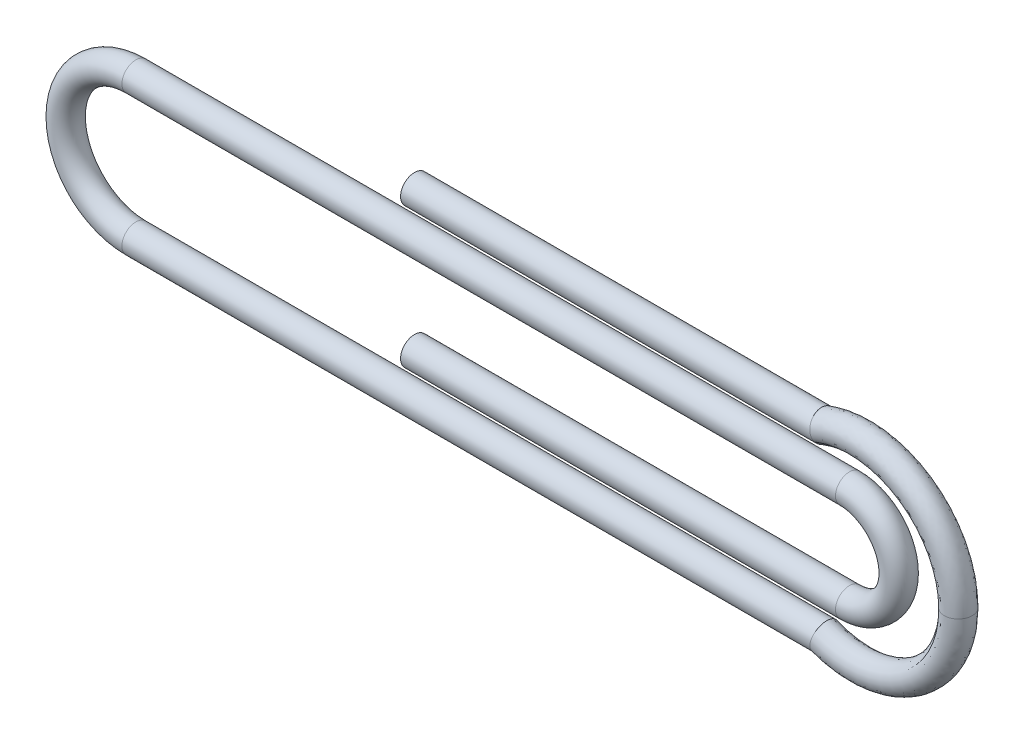
ISO-10303-21;
HEADER;
FILE_DESCRIPTION(('STEP AP214'),'2;1');
FILE_NAME('part.step','',(''),(''),'','','');
FILE_SCHEMA(('AUTOMOTIVE_DESIGN { 1 0 10303 214 1 1 1 1 }'));
ENDSEC;
DATA;
#1=APPLICATION_CONTEXT('core data for automotive mechanical design processes');
#2=APPLICATION_PROTOCOL_DEFINITION('international standard','automotive_design',2000,#1);
#3=PRODUCT_CONTEXT('',#1,'mechanical');
#4=PRODUCT('Part','Part','',(#3));
#5=PRODUCT_RELATED_PRODUCT_CATEGORY('part','',(#4));
#6=PRODUCT_DEFINITION_FORMATION('','',#4);
#7=PRODUCT_DEFINITION_CONTEXT('part definition',#1,'design');
#8=PRODUCT_DEFINITION('design','',#6,#7);
#9=PRODUCT_DEFINITION_SHAPE('','',#8);
#10=(LENGTH_UNIT() NAMED_UNIT(*) SI_UNIT(.MILLI.,.METRE.));
#11=(NAMED_UNIT(*) PLANE_ANGLE_UNIT() SI_UNIT($,.RADIAN.));
#12=(NAMED_UNIT(*) SI_UNIT($,.STERADIAN.) SOLID_ANGLE_UNIT());
#13=UNCERTAINTY_MEASURE_WITH_UNIT(LENGTH_MEASURE(1.E-05),#10,'distance_accuracy_value','');
#14=(GEOMETRIC_REPRESENTATION_CONTEXT(3) GLOBAL_UNCERTAINTY_ASSIGNED_CONTEXT((#13)) GLOBAL_UNIT_ASSIGNED_CONTEXT((#10,
#11,#12)) REPRESENTATION_CONTEXT('',''));
#15=CARTESIAN_POINT('',(0.,0.,0.));
#16=DIRECTION('',(0.,0.,1.));
#17=DIRECTION('',(1.,0.,0.));
#18=AXIS2_PLACEMENT_3D('',#15,#16,#17);
#19=CARTESIAN_POINT('',(10.,6.51827130528584,0.));
#20=DIRECTION('',(1.,0.,0.));
#21=DIRECTION('',(0.,0.,-1.));
#22=AXIS2_PLACEMENT_3D('',#19,#20,#21);
#23=PLANE('',#22);
#24=CARTESIAN_POINT('',(10.,6.51827130528584,0.));
#25=DIRECTION('',(1.,0.,0.));
#26=DIRECTION('',(0.,0.,-1.));
#27=AXIS2_PLACEMENT_3D('',#24,#25,#26);
#28=CIRCLE('',#27,0.5);
#29=CARTESIAN_POINT('',(10.,6.51827130528584,-0.5));
#30=VERTEX_POINT('',#29);
#31=EDGE_CURVE('E40',#30,#30,#28,.T.);
#32=ORIENTED_EDGE('',*,*,#31,.F.);
#33=EDGE_LOOP('',(#32));
#34=FACE_BOUND('',#33,.T.);
#35=ADVANCED_FACE('F37',(#34),#23,.F.);
#36=CARTESIAN_POINT('',(10.,1.48172869471416,0.));
#37=DIRECTION('',(-1.,0.,0.));
#38=DIRECTION('',(0.,0.,-1.));
#39=AXIS2_PLACEMENT_3D('',#36,#37,#38);
#40=PLANE('',#39);
#41=CARTESIAN_POINT('',(10.,1.48172869471416,0.));
#42=DIRECTION('',(-1.,0.,0.));
#43=DIRECTION('',(0.,0.,-1.));
#44=AXIS2_PLACEMENT_3D('',#41,#42,#43);
#45=CIRCLE('',#44,0.5);
#46=CARTESIAN_POINT('',(10.,1.48172869471416,-0.5));
#47=VERTEX_POINT('',#46);
#48=EDGE_CURVE('E66',#47,#47,#45,.T.);
#49=ORIENTED_EDGE('',*,*,#48,.T.);
#50=EDGE_LOOP('',(#49));
#51=FACE_BOUND('',#50,.T.);
#52=ADVANCED_FACE('F166',(#51),#40,.T.);
#53=CARTESIAN_POINT('',(25.0087890472503,6.51827130528584,0.));
#54=DIRECTION('',(-1.,0.,0.));
#55=DIRECTION('',(0.,0.,1.));
#56=AXIS2_PLACEMENT_3D('',#53,#54,#55);
#57=CYLINDRICAL_SURFACE('',#56,0.5);
#58=CARTESIAN_POINT('',(24.6974510198271,6.51827130528584,-0.5));
#59=CARTESIAN_POINT('',(24.6979128252086,6.51586532604812,-0.50000008112409));
#60=CARTESIAN_POINT('',(24.6983748347256,6.51345897893755,-0.49998270307403));
#61=CARTESIAN_POINT('',(24.7042958021241,6.48262805880136,-0.499536641275646));
#62=CARTESIAN_POINT('',(24.7097738895538,6.45419100536867,-0.496692408186464));
#63=CARTESIAN_POINT('',(24.7205654015077,6.39813220902491,-0.486192746560203));
#64=CARTESIAN_POINT('',(24.7258783449138,6.37051285776487,-0.478524432690641));
#65=CARTESIAN_POINT('',(24.7361833934617,6.31695373258012,-0.458569977823654));
#66=CARTESIAN_POINT('',(24.7411757984504,6.29101238879345,-0.446288228376455));
#67=CARTESIAN_POINT('',(24.7506949099361,6.24154750779714,-0.417425511246082));
#68=CARTESIAN_POINT('',(24.7552216159017,6.2180239733469,-0.40084453865637));
#69=CARTESIAN_POINT('',(24.7636361251327,6.17429825839734,-0.363995424596664));
#70=CARTESIAN_POINT('',(24.7675292257264,6.15406853890711,-0.3437611960116));
#71=CARTESIAN_POINT('',(24.7746047727773,6.11730199113667,-0.300064624511788));
#72=CARTESIAN_POINT('',(24.7777871954176,6.10076528662055,-0.276602173452126));
#73=CARTESIAN_POINT('',(24.783290935171,6.07216660841433,-0.227557305925839));
#74=CARTESIAN_POINT('',(24.7856263550773,6.06003134939908,-0.202019205866126));
#75=CARTESIAN_POINT('',(24.7894387918688,6.04022129666479,-0.149208786214473));
#76=CARTESIAN_POINT('',(24.7909159199287,6.03254592525619,-0.121936691734887));
#77=CARTESIAN_POINT('',(24.7929479580225,6.02198717462867,-0.0668952876950351));
#78=CARTESIAN_POINT('',(24.7935170683657,6.01903000832859,-0.0391406392573426));
#79=CARTESIAN_POINT('',(24.7937596648931,6.01776944699774,0.0164773749056384));
#80=CARTESIAN_POINT('',(24.7934331986611,6.01946580471515,0.0443407347763044));
#81=CARTESIAN_POINT('',(24.791900642206,6.02742916996284,0.0991778861764433));
#82=CARTESIAN_POINT('',(24.790700812833,6.03366364523707,0.126156588525529));
#83=CARTESIAN_POINT('',(24.787465981333,6.05047233859959,0.178673884621996));
#84=CARTESIAN_POINT('',(24.7854309295629,6.06104681464496,0.204212392665756));
#85=CARTESIAN_POINT('',(24.7805765470475,6.08627115754421,0.253258435612401));
#86=CARTESIAN_POINT('',(24.7777536358142,6.10093962988718,0.276756040668517));
#87=CARTESIAN_POINT('',(24.7714123907751,6.13389047643093,0.320953805770397));
#88=CARTESIAN_POINT('',(24.7678940436242,6.15217291998246,0.341653912120382));
#89=CARTESIAN_POINT('',(24.7601385905596,6.19247299493469,0.380343154746787));
#90=CARTESIAN_POINT('',(24.7558817477707,6.21459319486297,0.398221544504449));
#91=CARTESIAN_POINT('',(24.7468617928367,6.26146573355645,0.429943923289622));
#92=CARTESIAN_POINT('',(24.7420986503698,6.28621822996785,0.443787670499591));
#93=CARTESIAN_POINT('',(24.7322007456193,6.33765291612805,0.46709226858947));
#94=CARTESIAN_POINT('',(24.7270657354192,6.36433639321352,0.476550163825186));
#95=CARTESIAN_POINT('',(24.7165811218334,6.41882862381136,0.490817296558303));
#96=CARTESIAN_POINT('',(24.7112320090295,6.44663480597696,0.495636591388339));
#97=CARTESIAN_POINT('',(24.703513505327,6.4867347312487,0.499153392877056));
#98=CARTESIAN_POINT('',(24.7011731673864,6.4988904886366,0.499772362832632));
#99=CARTESIAN_POINT('',(24.6983748042415,6.51345861594475,0.499982611428312));
#100=CARTESIAN_POINT('',(24.697912788679,6.51586493656528,0.499999980303583));
#101=CARTESIAN_POINT('',(24.6974510198271,6.51827130528584,0.5));
#102=B_SPLINE_CURVE_WITH_KNOTS('',3,(#58,#59,#60,#61,#62,#63,#64,#65,#66,#67,#68,#69,#70,#71,
#72,#73,#74,#75,#76,#77,#78,#79,#80,#81,#82,#83,#84,#85,#86,#87,#88,#89,#90,#91,#92,#93,#94,#95,
#96,#97,#98,#99,#100,#101),.UNSPECIFIED.,.F.,.F.,(4,2,2,2,2,2,2,2,2,2,2,2,2,2,2,2,2,2,2,2,2,4),
(0.,0.00735079282661372,0.0941772782347521,0.181236671476123,0.268213401635697,
0.355190231058925,0.441397691866807,0.527608041313661,0.612308782398389,0.696998549742855,
0.78035041079382,0.863697843265427,0.94645359732551,1.0292142708604,1.11235735882446,
1.19550204242784,1.28136480810083,1.36723271892729,1.45315841270727,1.53889738139711,
1.57605364699727,1.58340443982389),.UNSPECIFIED.);
#103=CARTESIAN_POINT('',(24.6974510198271,6.51827130528584,0.5));
#104=VERTEX_POINT('',#103);
#105=CARTESIAN_POINT('',(24.6974510198271,6.51827130528584,-0.5));
#106=VERTEX_POINT('',#105);
#107=EDGE_CURVE('E62',#104,#106,#102,.F.);
#108=ORIENTED_EDGE('',*,*,#107,.F.);
#109=CARTESIAN_POINT('',(24.6974510198271,6.51827130528584,-0.5));
#110=CARTESIAN_POINT('',(24.6969893260269,6.52067730492518,-0.5000000836196));
#111=CARTESIAN_POINT('',(24.696527801124,6.52308374528001,-0.499982704889895));
#112=CARTESIAN_POINT('',(24.690628574572,6.55385978176499,-0.499537393001403));
#113=CARTESIAN_POINT('',(24.6852214829888,6.58225140777103,-0.496702945194379));
#114=CARTESIAN_POINT('',(24.6746284173897,6.63823288421355,-0.486234220315846));
#115=CARTESIAN_POINT('',(24.6694430717007,6.66582039381036,-0.478587159461257));
#116=CARTESIAN_POINT('',(24.6594467909802,6.7193309829366,-0.45868117466747));
#117=CARTESIAN_POINT('',(24.6546355268969,6.7452555216635,-0.446426360503982));
#118=CARTESIAN_POINT('',(24.645510971772,6.79469560169373,-0.417622173584099));
#119=CARTESIAN_POINT('',(24.6411976811191,6.81821114111731,-0.401072797476662));
#120=CARTESIAN_POINT('',(24.6332204171111,6.86191031598475,-0.364307072670188));
#121=CARTESIAN_POINT('',(24.6295506038295,6.88212379081953,-0.344127480190446));
#122=CARTESIAN_POINT('',(24.6229045095066,6.91887060533109,-0.300553423448326));
#123=CARTESIAN_POINT('',(24.6199282568779,6.93540379423899,-0.277158827541591));
#124=CARTESIAN_POINT('',(24.6147890745541,6.96403223929801,-0.228227313079005));
#125=CARTESIAN_POINT('',(24.6126137799631,6.9761948885177,-0.202731119134226));
#126=CARTESIAN_POINT('',(24.6090653395116,6.99606950541766,-0.150007798735317));
#127=CARTESIAN_POINT('',(24.6076921069227,7.00378195430393,-0.1227808597825));
#128=CARTESIAN_POINT('',(24.6057956105788,7.01444037356239,-0.0677580360365462));
#129=CARTESIAN_POINT('',(24.6052612839045,7.01744838082432,-0.0399745363754504));
#130=CARTESIAN_POINT('',(24.6050211412771,7.01879977054018,0.0157086814359478));
#131=CARTESIAN_POINT('',(24.6053152883259,7.01714336129897,0.0436083943408046));
#132=CARTESIAN_POINT('',(24.6067205182647,7.00924121863715,0.098563686604339));
#133=CARTESIAN_POINT('',(24.6078268886178,7.00302195910389,0.125623200759676));
#134=CARTESIAN_POINT('',(24.61082371245,6.98621575871341,0.178304475891478));
#135=CARTESIAN_POINT('',(24.6127142017383,6.97562861838453,0.203926171145154));
#136=CARTESIAN_POINT('',(24.6172411231464,6.95036087017029,0.253112406903263));
#137=CARTESIAN_POINT('',(24.6198802922598,6.93566524556318,0.276668976315726));
#138=CARTESIAN_POINT('',(24.6258366377452,6.90263832857917,0.320975865782577));
#139=CARTESIAN_POINT('',(24.6291537743398,6.88430724950199,0.341726350355755));
#140=CARTESIAN_POINT('',(24.6364285052827,6.84430677108067,0.380102763198885));
#141=CARTESIAN_POINT('',(24.6403931931803,6.82260054217977,0.397688945097373));
#142=CARTESIAN_POINT('',(24.6488367332467,6.77663792294735,0.428975058760762));
#143=CARTESIAN_POINT('',(24.6533156184415,6.75238136882107,0.442674740705777));
#144=CARTESIAN_POINT('',(24.6628238845171,6.7012063770364,0.466211468115668));
#145=CARTESIAN_POINT('',(24.6678661734108,6.67422810972582,0.475913043032216));
#146=CARTESIAN_POINT('',(24.6782368699608,6.61911087251465,0.490552492447936));
#147=CARTESIAN_POINT('',(24.6835646469678,6.59097449042429,0.4955004441263));
#148=CARTESIAN_POINT('',(24.691317947897,6.55029770703171,0.499128310059171));
#149=CARTESIAN_POINT('',(24.6936885055612,6.53789614020977,0.499768825838404));
#150=CARTESIAN_POINT('',(24.6965277390928,6.5230840883057,0.499982613041445));
#151=CARTESIAN_POINT('',(24.6969892598001,6.52067767222898,0.499999982614091));
#152=CARTESIAN_POINT('',(24.6974510198271,6.51827130528584,0.5));
#153=B_SPLINE_CURVE_WITH_KNOTS('',3,(#109,#110,#111,#112,#113,#114,#115,#116,#117,#118,#119,
#120,#121,#122,#123,#124,#125,#126,#127,#128,#129,#130,#131,#132,#133,#134,#135,#136,#137,#138,
#139,#140,#141,#142,#143,#144,#145,#146,#147,#148,#149,#150,#151,#152),.UNSPECIFIED.,.F.,.F.,(4,
2,2,2,2,2,2,2,2,2,2,2,2,2,2,2,2,2,2,2,2,4),(0.,0.00735079285504413,0.094003268374438,
0.180886896746572,0.267693214461599,0.354499599911687,0.440472032102338,0.526447985645239,
0.61103470775164,0.69561228167022,0.779064844419276,0.862513680378504,0.945482133085279,
1.02845437520106,1.1117339417366,1.1950086235306,1.27926565417052,1.36352809953198,
1.45044844873139,1.53718412670898,1.57508216837825,1.58243296123329),.UNSPECIFIED.);
#154=EDGE_CURVE('E60',#104,#106,#153,.F.);
#155=ORIENTED_EDGE('',*,*,#154,.T.);
#156=EDGE_LOOP('',(#108,#155));
#157=FACE_BOUND('',#156,.T.);
#158=ORIENTED_EDGE('',*,*,#31,.T.);
#159=EDGE_LOOP('',(#158));
#160=FACE_BOUND('',#159,.T.);
#161=ADVANCED_FACE('F68',(#157,#160),#57,.T.);
#162=CARTESIAN_POINT('',(29.5182713052858,3.25,-0.5));
#163=CARTESIAN_POINT('',(29.5182713052858,3.82202621269325,-0.5));
#164=CARTESIAN_POINT('',(29.3765629140462,4.3925793995391,-0.5));
#165=CARTESIAN_POINT('',(28.8394059864884,5.40509592377253,-0.5));
#166=CARTESIAN_POINT('',(28.4464489208966,5.84236022184112,-0.5));
#167=CARTESIAN_POINT('',(27.4991829569978,6.48386677292439,-0.5));
#168=CARTESIAN_POINT('',(26.9486969841599,6.68590485152432,-0.5));
#169=CARTESIAN_POINT('',(26.0956495328024,6.77858228309331,-0.5));
#170=CARTESIAN_POINT('',(25.8074197092568,6.77463484607182,-0.5));
#171=CARTESIAN_POINT('',(25.3820833446444,6.7165383643606,-0.5));
#172=CARTESIAN_POINT('',(25.2414583191273,6.68851442316137,-0.5));
#173=CARTESIAN_POINT('',(24.9643381803039,6.61543778926177,-0.5));
#174=CARTESIAN_POINT('',(24.8274990870925,6.57024314406871,-0.5));
#175=CARTESIAN_POINT('',(24.5986495469586,6.47879006657197,-0.5));
#176=CARTESIAN_POINT('',(24.5036207648526,6.44079874507733,-0.5));
#177=CARTESIAN_POINT('',(24.4083409318035,6.40271501158998,-0.5));
#178=CARTESIAN_POINT('',(30.5182713052858,3.25,-0.5));
#179=CARTESIAN_POINT('',(30.5182713052858,3.98461350715057,-0.5));
#180=CARTESIAN_POINT('',(30.3362850676424,4.71733530958566,-0.5));
#181=CARTESIAN_POINT('',(29.6464517598555,6.01763990823872,-0.5));
#182=CARTESIAN_POINT('',(29.1418043123982,6.57918805485852,-0.5));
#183=CARTESIAN_POINT('',(27.9252964732426,7.40303033147825,-0.5));
#184=CARTESIAN_POINT('',(27.2183455990165,7.66249379347504,-0.5));
#185=CARTESIAN_POINT('',(26.1228360470029,7.78151297743511,-0.5));
#186=CARTESIAN_POINT('',(25.7526825175987,7.77644355842885,-0.5));
#187=CARTESIAN_POINT('',(25.2064525868835,7.70183428487498,-0.5));
#188=CARTESIAN_POINT('',(25.0258576405403,7.6658450849541,-0.5));
#189=CARTESIAN_POINT('',(24.669971507063,7.57199784311705,-0.5));
#190=CARTESIAN_POINT('',(24.4753417473932,7.50640436510536,-0.5));
#191=CARTESIAN_POINT('',(24.2138837290176,7.40192294959777,-0.5));
#192=CARTESIAN_POINT('',(24.1324670203738,7.36937017364876,-0.5));
#193=CARTESIAN_POINT('',(24.0371871873245,7.33128644016141,-0.5));
#194=CARTESIAN_POINT('',(30.5182713052858,3.25,0.5));
#195=CARTESIAN_POINT('',(30.5182713052858,3.98461350715057,0.5));
#196=CARTESIAN_POINT('',(30.3362850676424,4.71733530958566,0.5));
#197=CARTESIAN_POINT('',(29.6464517598555,6.01763990823872,0.5));
#198=CARTESIAN_POINT('',(29.1418043123982,6.57918805485852,0.5));
#199=CARTESIAN_POINT('',(27.9252964732426,7.40303033147825,0.5));
#200=CARTESIAN_POINT('',(27.2183455990165,7.66249379347504,0.5));
#201=CARTESIAN_POINT('',(26.1228360470029,7.78151297743511,0.5));
#202=CARTESIAN_POINT('',(25.7526825175987,7.77644355842885,0.5));
#203=CARTESIAN_POINT('',(25.2064525868835,7.70183428487498,0.5));
#204=CARTESIAN_POINT('',(25.0258576405403,7.6658450849541,0.5));
#205=CARTESIAN_POINT('',(24.669971507063,7.57199784311705,0.5));
#206=CARTESIAN_POINT('',(24.4753417473932,7.50640436510536,0.5));
#207=CARTESIAN_POINT('',(24.2138837290176,7.40192294959777,0.5));
#208=CARTESIAN_POINT('',(24.1324670203738,7.36937017364876,0.5));
#209=CARTESIAN_POINT('',(24.0371871873245,7.33128644016141,0.5));
#210=CARTESIAN_POINT('',(29.5182713052858,3.25,0.5));
#211=CARTESIAN_POINT('',(29.5182713052858,3.82202621269325,0.5));
#212=CARTESIAN_POINT('',(29.3765629140462,4.3925793995391,0.5));
#213=CARTESIAN_POINT('',(28.8394059864884,5.40509592377253,0.5));
#214=CARTESIAN_POINT('',(28.4464489208966,5.84236022184112,0.5));
#215=CARTESIAN_POINT('',(27.4991829569978,6.48386677292439,0.5));
#216=CARTESIAN_POINT('',(26.9486969841599,6.68590485152432,0.5));
#217=CARTESIAN_POINT('',(26.0956495328024,6.77858228309331,0.5));
#218=CARTESIAN_POINT('',(25.8074197092568,6.77463484607182,0.5));
#219=CARTESIAN_POINT('',(25.3820833446444,6.7165383643606,0.5));
#220=CARTESIAN_POINT('',(25.2414583191273,6.68851442316137,0.5));
#221=CARTESIAN_POINT('',(24.9643381803039,6.61543778926177,0.5));
#222=CARTESIAN_POINT('',(24.8274990870925,6.57024314406871,0.5));
#223=CARTESIAN_POINT('',(24.5986495469586,6.47879006657197,0.5));
#224=CARTESIAN_POINT('',(24.5036207648526,6.44079874507733,0.5));
#225=CARTESIAN_POINT('',(24.4083409318035,6.40271501158998,0.5));
#226=CARTESIAN_POINT('',(28.5182713052858,3.25,0.5));
#227=CARTESIAN_POINT('',(28.5182713052858,3.65943891823593,0.5));
#228=CARTESIAN_POINT('',(28.41684076045,4.06782348949255,0.5));
#229=CARTESIAN_POINT('',(28.0323602131212,4.79255193930635,0.5));
#230=CARTESIAN_POINT('',(27.7510935293951,5.10553238882373,0.5));
#231=CARTESIAN_POINT('',(27.073069440753,5.56470321437053,0.5));
#232=CARTESIAN_POINT('',(26.6790483693032,5.70931590957361,0.5));
#233=CARTESIAN_POINT('',(26.068463018602,5.77565158875152,0.5));
#234=CARTESIAN_POINT('',(25.8621569009149,5.77282613371478,0.5));
#235=CARTESIAN_POINT('',(25.5577141024053,5.73124244384622,0.5));
#236=CARTESIAN_POINT('',(25.4570589977143,5.71118376136863,0.5));
#237=CARTESIAN_POINT('',(25.2587048535448,5.65887773540648,0.5));
#238=CARTESIAN_POINT('',(25.1796564267918,5.63408192303207,0.5));
#239=CARTESIAN_POINT('',(24.9834153648997,5.55565718354617,0.5));
#240=CARTESIAN_POINT('',(24.8747745093314,5.5122273165059,0.5));
#241=CARTESIAN_POINT('',(24.7794946762826,5.47414358301855,0.5));
#242=CARTESIAN_POINT('',(28.5182713052858,3.25,-0.5));
#243=CARTESIAN_POINT('',(28.5182713052858,3.65943891823593,-0.5));
#244=CARTESIAN_POINT('',(28.41684076045,4.06782348949255,-0.5));
#245=CARTESIAN_POINT('',(28.0323602131212,4.79255193930635,-0.5));
#246=CARTESIAN_POINT('',(27.7510935293951,5.10553238882373,-0.5));
#247=CARTESIAN_POINT('',(27.073069440753,5.56470321437053,-0.5));
#248=CARTESIAN_POINT('',(26.6790483693032,5.70931590957361,-0.5));
#249=CARTESIAN_POINT('',(26.068463018602,5.77565158875152,-0.5));
#250=CARTESIAN_POINT('',(25.8621569009149,5.77282613371478,-0.5));
#251=CARTESIAN_POINT('',(25.5577141024053,5.73124244384622,-0.5));
#252=CARTESIAN_POINT('',(25.4570589977143,5.71118376136863,-0.5));
#253=CARTESIAN_POINT('',(25.2587048535448,5.65887773540648,-0.5));
#254=CARTESIAN_POINT('',(25.1796564267918,5.63408192303207,-0.5));
#255=CARTESIAN_POINT('',(24.9834153648997,5.55565718354617,-0.5));
#256=CARTESIAN_POINT('',(24.8747745093314,5.5122273165059,-0.5));
#257=CARTESIAN_POINT('',(24.7794946762826,5.47414358301855,-0.5));
#258=CARTESIAN_POINT('',(29.5182713052858,3.25,-0.5));
#259=CARTESIAN_POINT('',(29.5182713052858,3.82202621269325,-0.5));
#260=CARTESIAN_POINT('',(29.3765629140462,4.3925793995391,-0.5));
#261=CARTESIAN_POINT('',(28.8394059864884,5.40509592377253,-0.5));
#262=CARTESIAN_POINT('',(28.4464489208966,5.84236022184112,-0.5));
#263=CARTESIAN_POINT('',(27.4991829569978,6.48386677292439,-0.5));
#264=CARTESIAN_POINT('',(26.9486969841599,6.68590485152432,-0.5));
#265=CARTESIAN_POINT('',(26.0956495328024,6.77858228309331,-0.5));
#266=CARTESIAN_POINT('',(25.8074197092568,6.77463484607182,-0.5));
#267=CARTESIAN_POINT('',(25.3820833446444,6.7165383643606,-0.5));
#268=CARTESIAN_POINT('',(25.2414583191273,6.68851442316137,-0.5));
#269=CARTESIAN_POINT('',(24.9643381803039,6.61543778926177,-0.5));
#270=CARTESIAN_POINT('',(24.8274990870925,6.57024314406871,-0.5));
#271=CARTESIAN_POINT('',(24.5986495469586,6.47879006657197,-0.5));
#272=CARTESIAN_POINT('',(24.5036207648526,6.44079874507733,-0.5));
#273=CARTESIAN_POINT('',(24.4083409318035,6.40271501158998,-0.5));
#274=(BOUNDED_SURFACE() B_SPLINE_SURFACE(3,3,((#162,#163,#164,#165,#166,#167,#168,#169,#170,
#171,#172,#173,#174,#175,#176,#177),(#178,#179,#180,#181,#182,#183,#184,#185,#186,#187,#188,
#189,#190,#191,#192,#193),(#194,#195,#196,#197,#198,#199,#200,#201,#202,#203,#204,#205,#206,
#207,#208,#209),(#210,#211,#212,#213,#214,#215,#216,#217,#218,#219,#220,#221,#222,#223,#224,
#225),(#226,#227,#228,#229,#230,#231,#232,#233,#234,#235,#236,#237,#238,#239,#240,#241),(#242,
#243,#244,#245,#246,#247,#248,#249,#250,#251,#252,#253,#254,#255,#256,#257),(#258,#259,#260,
#261,#262,#263,#264,#265,#266,#267,#268,#269,#270,#271,#272,#273)),.UNSPECIFIED.,.T.,.F.,
.F.) B_SPLINE_SURFACE_WITH_KNOTS((4,3,4),(4,2,2,2,2,2,2,4),(0.,0.5,1.),(0.5,0.625,0.75,0.875,
0.9375,0.96875,1.,1.02239251587968),
.UNSPECIFIED.) GEOMETRIC_REPRESENTATION_ITEM() RATIONAL_B_SPLINE_SURFACE(((1.,1.,1.,1.,1.,1.,1.,
1.,1.,1.,1.,1.,1.,1.,1.,1.),(0.333333333333333,0.333333333333333,0.333333333333333,
0.333333333333333,0.333333333333333,0.333333333333333,0.333333333333333,0.333333333333333,
0.333333333333333,0.333333333333333,0.333333333333333,0.333333333333333,0.333333333333333,
0.333333333333333,0.333333333333333,0.333333333333333),(0.333333333333333,0.333333333333333,
0.333333333333333,0.333333333333333,0.333333333333333,0.333333333333333,0.333333333333333,
0.333333333333333,0.333333333333333,0.333333333333333,0.333333333333333,0.333333333333333,
0.333333333333333,0.333333333333333,0.333333333333333,0.333333333333333),(1.,1.,1.,1.,1.,1.,1.,
1.,1.,1.,1.,1.,1.,1.,1.,1.),(0.333333333333333,0.333333333333333,0.333333333333333,
0.333333333333333,0.333333333333333,0.333333333333333,0.333333333333333,0.333333333333333,
0.333333333333333,0.333333333333333,0.333333333333333,0.333333333333333,0.333333333333333,
0.333333333333333,0.333333333333333,0.333333333333333),(0.333333333333333,0.333333333333333,
0.333333333333333,0.333333333333333,0.333333333333333,0.333333333333333,0.333333333333333,
0.333333333333333,0.333333333333333,0.333333333333333,0.333333333333333,0.333333333333333,
0.333333333333333,0.333333333333333,0.333333333333333,0.333333333333333),(1.,1.,1.,1.,1.,1.,1.,
1.,1.,1.,1.,1.,1.,1.,1.,1.))) REPRESENTATION_ITEM('') SURFACE());
#275=CARTESIAN_POINT('',(29.5182713052858,3.25,0.));
#276=DIRECTION('',(0.,-1.,0.));
#277=DIRECTION('',(0.,0.,-1.));
#278=AXIS2_PLACEMENT_3D('',#275,#276,#277);
#279=CIRCLE('',#278,0.5);
#280=CARTESIAN_POINT('',(29.5182713052858,3.25,-0.5));
#281=VERTEX_POINT('',#280);
#282=EDGE_CURVE('E70',#281,#281,#279,.T.);
#283=ORIENTED_EDGE('',*,*,#107,.T.);
#284=ORIENTED_EDGE('',*,*,#154,.F.);
#285=EDGE_LOOP('',(#283,#284));
#286=FACE_BOUND('',#285,.T.);
#287=ORIENTED_EDGE('',*,*,#282,.F.);
#288=EDGE_LOOP('',(#287));
#289=FACE_BOUND('',#288,.T.);
#290=ADVANCED_FACE('F63',(#286,#289),#274,.F.);
#291=CARTESIAN_POINT('',(24.4083409318035,0.0972849884100188,-0.5));
#292=CARTESIAN_POINT('',(24.5036207648527,0.0592012549228758,-0.5));
#293=CARTESIAN_POINT('',(24.5986495469587,0.0212099334279089,-0.5));
#294=CARTESIAN_POINT('',(24.8274990870925,-0.0702431440685451,-0.5));
#295=CARTESIAN_POINT('',(24.9643381803049,-0.115437789262022,-0.5));
#296=CARTESIAN_POINT('',(25.2414583191263,-0.188514423161111,-0.5));
#297=CARTESIAN_POINT('',(25.3820833446446,-0.21653836436059,-0.5));
#298=CARTESIAN_POINT('',(25.8074197092564,-0.274634846071839,-0.5));
#299=CARTESIAN_POINT('',(26.095649532803,-0.278582283093056,-0.5));
#300=CARTESIAN_POINT('',(26.9486969841587,-0.185904851524841,-0.5));
#301=CARTESIAN_POINT('',(27.4991829569956,0.0161332270749333,-0.5));
#302=CARTESIAN_POINT('',(28.4464489208989,0.657639778159552,-0.5));
#303=CARTESIAN_POINT('',(28.8394059864881,1.09490407622708,-0.5));
#304=CARTESIAN_POINT('',(29.3765629140464,2.10742060046128,-0.5));
#305=CARTESIAN_POINT('',(29.5182713052858,2.67797378730675,-0.5));
#306=CARTESIAN_POINT('',(29.5182713052858,3.25,-0.5));
#307=CARTESIAN_POINT('',(24.0371871873245,-0.83128644016141,-0.5));
#308=CARTESIAN_POINT('',(24.1324670203737,-0.869370173648553,-0.5));
#309=CARTESIAN_POINT('',(24.2138837290176,-0.901922949597938,-0.5));
#310=CARTESIAN_POINT('',(24.4753417473932,-1.00640436510513,-0.5));
#311=CARTESIAN_POINT('',(24.6699715070642,-1.07199784311739,-0.5));
#312=CARTESIAN_POINT('',(25.025857640539,-1.16584508495377,-0.5));
#313=CARTESIAN_POINT('',(25.2064525868837,-1.20183428487491,-0.5));
#314=CARTESIAN_POINT('',(25.7526825175981,-1.27644355842901,-0.5));
#315=CARTESIAN_POINT('',(26.1228360470035,-1.28151297743485,-0.5));
#316=CARTESIAN_POINT('',(27.2183455990152,-1.16249379347556,-0.5));
#317=CARTESIAN_POINT('',(27.9252964732398,-0.903030331479099,-0.5));
#318=CARTESIAN_POINT('',(29.141804312401,-0.079188054857669,-0.5));
#319=CARTESIAN_POINT('',(29.6464517598543,0.482360091760789,-0.5));
#320=CARTESIAN_POINT('',(30.3362850676436,1.78266469041484,-0.5));
#321=CARTESIAN_POINT('',(30.5182713052858,2.51538649284943,-0.5));
#322=CARTESIAN_POINT('',(30.5182713052858,3.25,-0.5));
#323=CARTESIAN_POINT('',(24.0371871873245,-0.83128644016141,0.5));
#324=CARTESIAN_POINT('',(24.1324670203737,-0.869370173648553,0.5));
#325=CARTESIAN_POINT('',(24.2138837290176,-0.901922949597938,0.5));
#326=CARTESIAN_POINT('',(24.4753417473932,-1.00640436510513,0.5));
#327=CARTESIAN_POINT('',(24.6699715070642,-1.07199784311739,0.5));
#328=CARTESIAN_POINT('',(25.025857640539,-1.16584508495377,0.5));
#329=CARTESIAN_POINT('',(25.2064525868837,-1.20183428487491,0.5));
#330=CARTESIAN_POINT('',(25.7526825175981,-1.27644355842901,0.5));
#331=CARTESIAN_POINT('',(26.1228360470035,-1.28151297743485,0.5));
#332=CARTESIAN_POINT('',(27.2183455990152,-1.16249379347556,0.5));
#333=CARTESIAN_POINT('',(27.9252964732398,-0.903030331479099,0.5));
#334=CARTESIAN_POINT('',(29.141804312401,-0.079188054857669,0.5));
#335=CARTESIAN_POINT('',(29.6464517598543,0.482360091760789,0.5));
#336=CARTESIAN_POINT('',(30.3362850676436,1.78266469041484,0.5));
#337=CARTESIAN_POINT('',(30.5182713052858,2.51538649284943,0.5));
#338=CARTESIAN_POINT('',(30.5182713052858,3.25,0.5));
#339=CARTESIAN_POINT('',(24.4083409318035,0.0972849884100188,0.5));
#340=CARTESIAN_POINT('',(24.5036207648527,0.0592012549228758,0.5));
#341=CARTESIAN_POINT('',(24.5986495469587,0.0212099334279089,0.5));
#342=CARTESIAN_POINT('',(24.8274990870925,-0.0702431440685451,0.5));
#343=CARTESIAN_POINT('',(24.9643381803049,-0.115437789262022,0.5));
#344=CARTESIAN_POINT('',(25.2414583191263,-0.188514423161111,0.5));
#345=CARTESIAN_POINT('',(25.3820833446446,-0.21653836436059,0.5));
#346=CARTESIAN_POINT('',(25.8074197092564,-0.274634846071839,0.5));
#347=CARTESIAN_POINT('',(26.095649532803,-0.278582283093056,0.5));
#348=CARTESIAN_POINT('',(26.9486969841587,-0.185904851524841,0.5));
#349=CARTESIAN_POINT('',(27.4991829569956,0.0161332270749333,0.5));
#350=CARTESIAN_POINT('',(28.4464489208989,0.657639778159552,0.5));
#351=CARTESIAN_POINT('',(28.8394059864881,1.09490407622708,0.5));
#352=CARTESIAN_POINT('',(29.3765629140464,2.10742060046128,0.5));
#353=CARTESIAN_POINT('',(29.5182713052858,2.67797378730675,0.5));
#354=CARTESIAN_POINT('',(29.5182713052858,3.25,0.5));
#355=CARTESIAN_POINT('',(24.7794946762826,1.02585641698145,0.5));
#356=CARTESIAN_POINT('',(24.8747745093318,0.987772683494304,0.5));
#357=CARTESIAN_POINT('',(24.9834153648997,0.944342816453755,0.5));
#358=CARTESIAN_POINT('',(25.1796564267918,0.865918076968037,0.5));
#359=CARTESIAN_POINT('',(25.2587048535456,0.841122264593342,0.5));
#360=CARTESIAN_POINT('',(25.4570589977135,0.788816238631544,0.5));
#361=CARTESIAN_POINT('',(25.5577141024054,0.768757556153726,0.5));
#362=CARTESIAN_POINT('',(25.8621569009148,0.727173866285327,0.5));
#363=CARTESIAN_POINT('',(26.0684630186025,0.724348411248736,0.5));
#364=CARTESIAN_POINT('',(26.6790483693021,0.790684090425879,0.5));
#365=CARTESIAN_POINT('',(27.0730694407513,0.935296785628965,0.5));
#366=CARTESIAN_POINT('',(27.7510935293967,1.39446761117677,0.5));
#367=CARTESIAN_POINT('',(28.032360213122,1.70744806069338,0.5));
#368=CARTESIAN_POINT('',(28.4168407604492,2.43217651050773,0.5));
#369=CARTESIAN_POINT('',(28.5182713052858,2.84056108176407,0.5));
#370=CARTESIAN_POINT('',(28.5182713052858,3.25,0.5));
#371=CARTESIAN_POINT('',(24.7794946762826,1.02585641698145,-0.5));
#372=CARTESIAN_POINT('',(24.8747745093318,0.987772683494304,-0.5));
#373=CARTESIAN_POINT('',(24.9834153648997,0.944342816453755,-0.5));
#374=CARTESIAN_POINT('',(25.1796564267918,0.865918076968037,-0.5));
#375=CARTESIAN_POINT('',(25.2587048535456,0.841122264593342,-0.5));
#376=CARTESIAN_POINT('',(25.4570589977135,0.788816238631544,-0.5));
#377=CARTESIAN_POINT('',(25.5577141024054,0.768757556153726,-0.5));
#378=CARTESIAN_POINT('',(25.8621569009148,0.727173866285327,-0.5));
#379=CARTESIAN_POINT('',(26.0684630186025,0.724348411248736,-0.5));
#380=CARTESIAN_POINT('',(26.6790483693021,0.790684090425879,-0.5));
#381=CARTESIAN_POINT('',(27.0730694407513,0.935296785628965,-0.5));
#382=CARTESIAN_POINT('',(27.7510935293967,1.39446761117677,-0.5));
#383=CARTESIAN_POINT('',(28.032360213122,1.70744806069338,-0.5));
#384=CARTESIAN_POINT('',(28.4168407604492,2.43217651050773,-0.5));
#385=CARTESIAN_POINT('',(28.5182713052858,2.84056108176407,-0.5));
#386=CARTESIAN_POINT('',(28.5182713052858,3.25,-0.5));
#387=CARTESIAN_POINT('',(24.4083409318035,0.0972849884100188,-0.5));
#388=CARTESIAN_POINT('',(24.5036207648527,0.0592012549228758,-0.5));
#389=CARTESIAN_POINT('',(24.5986495469587,0.0212099334279089,-0.5));
#390=CARTESIAN_POINT('',(24.8274990870925,-0.0702431440685451,-0.5));
#391=CARTESIAN_POINT('',(24.9643381803049,-0.115437789262022,-0.5));
#392=CARTESIAN_POINT('',(25.2414583191263,-0.188514423161111,-0.5));
#393=CARTESIAN_POINT('',(25.3820833446446,-0.21653836436059,-0.5));
#394=CARTESIAN_POINT('',(25.8074197092564,-0.274634846071839,-0.5));
#395=CARTESIAN_POINT('',(26.095649532803,-0.278582283093056,-0.5));
#396=CARTESIAN_POINT('',(26.9486969841587,-0.185904851524841,-0.5));
#397=CARTESIAN_POINT('',(27.4991829569956,0.0161332270749333,-0.5));
#398=CARTESIAN_POINT('',(28.4464489208989,0.657639778159552,-0.5));
#399=CARTESIAN_POINT('',(28.8394059864881,1.09490407622708,-0.5));
#400=CARTESIAN_POINT('',(29.3765629140464,2.10742060046128,-0.5));
#401=CARTESIAN_POINT('',(29.5182713052858,2.67797378730675,-0.5));
#402=CARTESIAN_POINT('',(29.5182713052858,3.25,-0.5));
#403=(BOUNDED_SURFACE() B_SPLINE_SURFACE(3,3,((#291,#292,#293,#294,#295,#296,#297,#298,#299,
#300,#301,#302,#303,#304,#305,#306),(#307,#308,#309,#310,#311,#312,#313,#314,#315,#316,#317,
#318,#319,#320,#321,#322),(#323,#324,#325,#326,#327,#328,#329,#330,#331,#332,#333,#334,#335,
#336,#337,#338),(#339,#340,#341,#342,#343,#344,#345,#346,#347,#348,#349,#350,#351,#352,#353,
#354),(#355,#356,#357,#358,#359,#360,#361,#362,#363,#364,#365,#366,#367,#368,#369,#370),(#371,
#372,#373,#374,#375,#376,#377,#378,#379,#380,#381,#382,#383,#384,#385,#386),(#387,#388,#389,
#390,#391,#392,#393,#394,#395,#396,#397,#398,#399,#400,#401,#402)),.UNSPECIFIED.,.T.,.F.,
.F.) B_SPLINE_SURFACE_WITH_KNOTS((4,3,4),(4,2,2,2,2,2,2,4),(0.,0.5,1.),(-0.0223925158796798,0.,
0.03125,0.0625,0.125,0.25,0.375,0.5),
.UNSPECIFIED.) GEOMETRIC_REPRESENTATION_ITEM() RATIONAL_B_SPLINE_SURFACE(((1.,1.,1.,1.,1.,1.,1.,
1.,1.,1.,1.,1.,1.,1.,1.,1.),(0.333333333333333,0.333333333333333,0.333333333333333,
0.333333333333333,0.333333333333333,0.333333333333333,0.333333333333333,0.333333333333333,
0.333333333333333,0.333333333333333,0.333333333333333,0.333333333333333,0.333333333333333,
0.333333333333333,0.333333333333333,0.333333333333333),(0.333333333333333,0.333333333333333,
0.333333333333333,0.333333333333333,0.333333333333333,0.333333333333333,0.333333333333333,
0.333333333333333,0.333333333333333,0.333333333333333,0.333333333333333,0.333333333333333,
0.333333333333333,0.333333333333333,0.333333333333333,0.333333333333333),(1.,1.,1.,1.,1.,1.,1.,
1.,1.,1.,1.,1.,1.,1.,1.,1.),(0.333333333333333,0.333333333333333,0.333333333333333,
0.333333333333333,0.333333333333333,0.333333333333333,0.333333333333333,0.333333333333333,
0.333333333333333,0.333333333333333,0.333333333333333,0.333333333333333,0.333333333333333,
0.333333333333333,0.333333333333333,0.333333333333333),(0.333333333333333,0.333333333333333,
0.333333333333333,0.333333333333333,0.333333333333333,0.333333333333333,0.333333333333333,
0.333333333333333,0.333333333333333,0.333333333333333,0.333333333333333,0.333333333333333,
0.333333333333333,0.333333333333333,0.333333333333333,0.333333333333333),(1.,1.,1.,1.,1.,1.,1.,
1.,1.,1.,1.,1.,1.,1.,1.,1.))) REPRESENTATION_ITEM('') SURFACE());
#404=CARTESIAN_POINT('',(24.6974510198197,-0.0182713052858456,-0.500000000000387));
#405=CARTESIAN_POINT('',(24.6969893260222,-0.0206773049257084,-0.500000083619833));
#406=CARTESIAN_POINT('',(24.6965278011217,-0.0230837452809919,-0.499982704889994));
#407=CARTESIAN_POINT('',(24.6906285745962,-0.0538597817711488,-0.499537392999983));
#408=CARTESIAN_POINT('',(24.6852214829951,-0.0822514077738499,-0.496702945193825));
#409=CARTESIAN_POINT('',(24.6746284173829,-0.138232884213818,-0.486234220315823));
#410=CARTESIAN_POINT('',(24.6694430716988,-0.165820393811436,-0.47858715946093));
#411=CARTESIAN_POINT('',(24.6594467909819,-0.219330982938221,-0.458681174666835));
#412=CARTESIAN_POINT('',(24.6546355268972,-0.245255521664844,-0.446426360503325));
#413=CARTESIAN_POINT('',(24.6455109717715,-0.294695601694809,-0.417622173583346));
#414=CARTESIAN_POINT('',(24.6411976811189,-0.318211141118397,-0.401072797475841));
#415=CARTESIAN_POINT('',(24.6332204171113,-0.361910315985763,-0.364307072669245));
#416=CARTESIAN_POINT('',(24.6295506038296,-0.382123790820463,-0.344127480189445));
#417=CARTESIAN_POINT('',(24.6229045095066,-0.418870605331916,-0.30055342344724));
#418=CARTESIAN_POINT('',(24.619928256878,-0.435403794239788,-0.277158827540482));
#419=CARTESIAN_POINT('',(24.6147890745542,-0.464032239298585,-0.228227313077777));
#420=CARTESIAN_POINT('',(24.6126137799633,-0.476194888518069,-0.202731119132898));
#421=CARTESIAN_POINT('',(24.6090653395117,-0.496069505418288,-0.150007798734021));
#422=CARTESIAN_POINT('',(24.6076921069229,-0.503781954305017,-0.122780859781338));
#423=CARTESIAN_POINT('',(24.605795610579,-0.514440373563366,-0.067758036035441));
#424=CARTESIAN_POINT('',(24.6052612839047,-0.517448380824733,-0.0399745363742704));
#425=CARTESIAN_POINT('',(24.6050211412773,-0.518799770539826,0.0157086814371812));
#426=CARTESIAN_POINT('',(24.6053152883261,-0.517143361298419,0.0436083943420168));
#427=CARTESIAN_POINT('',(24.606720518265,-0.509241218636559,0.0985636866055743));
#428=CARTESIAN_POINT('',(24.607826888618,-0.503021959103467,0.125623200760955));
#429=CARTESIAN_POINT('',(24.6108237124503,-0.486215758713023,0.178304475892748));
#430=CARTESIAN_POINT('',(24.6127142017386,-0.475628618384018,0.203926171146371));
#431=CARTESIAN_POINT('',(24.6172411231468,-0.450360870169611,0.253112406904384));
#432=CARTESIAN_POINT('',(24.6198802922601,-0.435665245562462,0.276668976316804));
#433=CARTESIAN_POINT('',(24.6258366377455,-0.402638328578347,0.320975865783579));
#434=CARTESIAN_POINT('',(24.6291537743402,-0.384307249501094,0.341726350356721));
#435=CARTESIAN_POINT('',(24.636428505283,-0.344306771079662,0.380102763199757));
#436=CARTESIAN_POINT('',(24.6403931931807,-0.32260054217871,0.397688945098188));
#437=CARTESIAN_POINT('',(24.6488367332471,-0.276637922946201,0.428975058761456));
#438=CARTESIAN_POINT('',(24.6533156184419,-0.252381368819874,0.442674740706407));
#439=CARTESIAN_POINT('',(24.6628238845174,-0.201206377035134,0.466211468116161));
#440=CARTESIAN_POINT('',(24.6678661734111,-0.174228109724531,0.475913043032637));
#441=CARTESIAN_POINT('',(24.6782368699611,-0.119110872513326,0.490552492448209));
#442=CARTESIAN_POINT('',(24.6835646469681,-0.0909744904229631,0.495500444126498));
#443=CARTESIAN_POINT('',(24.6913179478972,-0.0502977070308142,0.499128310059217));
#444=CARTESIAN_POINT('',(24.6936885055612,-0.0378961402093152,0.49976882583841));
#445=CARTESIAN_POINT('',(24.6965277390928,-0.0230840883057068,0.499982613041445));
#446=CARTESIAN_POINT('',(24.6969892598001,-0.0206776722289825,0.499999982614091));
#447=CARTESIAN_POINT('',(24.6974510198271,-0.0182713052858456,0.5));
#448=B_SPLINE_CURVE_WITH_KNOTS('',3,(#404,#405,#406,#407,#408,#409,#410,#411,#412,#413,#414,
#415,#416,#417,#418,#419,#420,#421,#422,#423,#424,#425,#426,#427,#428,#429,#430,#431,#432,#433,
#434,#435,#436,#437,#438,#439,#440,#441,#442,#443,#444,#445,#446,#447),.UNSPECIFIED.,.F.,.F.,(4,
2,2,2,2,2,2,2,2,2,2,2,2,2,2,2,2,2,2,2,2,4),(0.,0.00735079285505529,0.0940032683747216,
0.180886896746552,0.267693214461617,0.354499599911627,0.440472032102294,0.526447985645143,
0.611034707751635,0.695612281670167,0.779064844419158,0.86251368037848,0.94548213308526,
1.02845437520101,1.11173394173652,1.19500862353058,1.27926565417051,1.36352809953197,
1.45044844873138,1.53718412670895,1.57508216837684,1.5824329612319),.UNSPECIFIED.);
#449=CARTESIAN_POINT('',(24.6974510198271,-0.0182713052858456,0.5));
#450=VERTEX_POINT('',#449);
#451=CARTESIAN_POINT('',(24.6974510198197,-0.0182713052858456,-0.500000000000387));
#452=VERTEX_POINT('',#451);
#453=EDGE_CURVE('E46',#450,#452,#448,.F.);
#454=CARTESIAN_POINT('',(24.6974510198197,-0.0182713052858456,-0.500000000000387));
#455=CARTESIAN_POINT('',(24.6979128252039,-0.0158653260486427,-0.500000081124337));
#456=CARTESIAN_POINT('',(24.6983748347233,-0.013458978938535,-0.499982703074156));
#457=CARTESIAN_POINT('',(24.7042958021485,0.0173719411926007,-0.499536641274421));
#458=CARTESIAN_POINT('',(24.7097738895602,0.0458089946288593,-0.496692408186263));
#459=CARTESIAN_POINT('',(24.7205654015008,0.101867790975203,-0.486192746560848));
#460=CARTESIAN_POINT('',(24.7258783449117,0.129487142234253,-0.478524432691132));
#461=CARTESIAN_POINT('',(24.7361833934632,0.183046267418317,-0.458569977824121));
#462=CARTESIAN_POINT('',(24.7411757984506,0.208987611205283,-0.446288228377037));
#463=CARTESIAN_POINT('',(24.7506949099354,0.258452492201842,-0.417425511246834));
#464=CARTESIAN_POINT('',(24.7552216159013,0.281976026652043,-0.400844538657181));
#465=CARTESIAN_POINT('',(24.7636361251327,0.325701741601666,-0.363995424597577));
#466=CARTESIAN_POINT('',(24.7675292257262,0.345931461091991,-0.343761196012548));
#467=CARTESIAN_POINT('',(24.7746047727771,0.382698008862556,-0.300064624512824));
#468=CARTESIAN_POINT('',(24.7777871954174,0.399234713378718,-0.27660217345322));
#469=CARTESIAN_POINT('',(24.7832909351709,0.427833391585062,-0.227557305927022));
#470=CARTESIAN_POINT('',(24.7856263550773,0.439968650600388,-0.202019205867338));
#471=CARTESIAN_POINT('',(24.7894387918688,0.459778703334819,-0.149208786215728));
#472=CARTESIAN_POINT('',(24.7909159199286,0.467454074743488,-0.121936691736157));
#473=CARTESIAN_POINT('',(24.7929479580225,0.478012825371157,-0.0668952876963231));
#474=CARTESIAN_POINT('',(24.7935170683658,0.480969991671305,-0.039140639258635));
#475=CARTESIAN_POINT('',(24.7937596648932,0.482230553002298,0.0164773749043459));
#476=CARTESIAN_POINT('',(24.7934331986612,0.480534195284967,0.0443407347750161));
#477=CARTESIAN_POINT('',(24.7919006422061,0.47257083003742,0.0991778861751724));
#478=CARTESIAN_POINT('',(24.7907008128331,0.466336354763256,0.126156588524272));
#479=CARTESIAN_POINT('',(24.7874659813332,0.449527661400869,0.178673884620777));
#480=CARTESIAN_POINT('',(24.785430929563,0.438953185355571,0.204212392664564));
#481=CARTESIAN_POINT('',(24.7805765470476,0.413728842456448,0.253258435611271));
#482=CARTESIAN_POINT('',(24.7777536358144,0.399060370113548,0.276756040667422));
#483=CARTESIAN_POINT('',(24.7714123907753,0.366109523569914,0.320953805769382));
#484=CARTESIAN_POINT('',(24.7678940436244,0.347827080018441,0.341653912119413));
#485=CARTESIAN_POINT('',(24.7601385905598,0.307527005066319,0.380343154745923));
#486=CARTESIAN_POINT('',(24.7558817477709,0.285406805138083,0.398221544503643));
#487=CARTESIAN_POINT('',(24.7468617928369,0.238534266444687,0.42994392328894));
#488=CARTESIAN_POINT('',(24.74209865037,0.213781770033331,0.443787670498973));
#489=CARTESIAN_POINT('',(24.7322007456195,0.162347083873188,0.467092268588989));
#490=CARTESIAN_POINT('',(24.7270657354194,0.135663606787741,0.476550163824777));
#491=CARTESIAN_POINT('',(24.7165811218336,0.0811713761899365,0.490817296558041));
#492=CARTESIAN_POINT('',(24.7112320090297,0.053365194024358,0.49563659138815));
#493=CARTESIAN_POINT('',(24.7035135053272,0.0132652687521728,0.499153392877011));
#494=CARTESIAN_POINT('',(24.7011731673865,0.00110951136383775,0.499772362832625));
#495=CARTESIAN_POINT('',(24.6983748042416,-0.0134586159447453,0.499982611428312));
#496=CARTESIAN_POINT('',(24.697912788679,-0.0158649365652782,0.499999980303583));
#497=CARTESIAN_POINT('',(24.6974510198271,-0.0182713052858456,0.5));
#498=B_SPLINE_CURVE_WITH_KNOTS('',3,(#454,#455,#456,#457,#458,#459,#460,#461,#462,#463,#464,
#465,#466,#467,#468,#469,#470,#471,#472,#473,#474,#475,#476,#477,#478,#479,#480,#481,#482,#483,
#484,#485,#486,#487,#488,#489,#490,#491,#492,#493,#494,#495,#496,#497),.UNSPECIFIED.,.F.,.F.,(4,
2,2,2,2,2,2,2,2,2,2,2,2,2,2,2,2,2,2,2,2,4),(0.,0.00735079282662139,0.0941772782350094,
0.181236671476144,0.268213401635775,0.355190231058958,0.441397691866934,0.527608041313736,
0.612308782398481,0.696998549742967,0.780350410793943,0.863697843265548,0.946453597325624,
1.02921427086051,1.11235735882456,1.19550204242793,1.28136480810091,1.36723271892737,
1.45315841270735,1.53889738139718,1.57605364699868,1.5834044398253),.UNSPECIFIED.);
#499=EDGE_CURVE('E11',#450,#452,#498,.F.);
#500=ORIENTED_EDGE('',*,*,#453,.T.);
#501=ORIENTED_EDGE('',*,*,#499,.F.);
#502=EDGE_LOOP('',(#500,#501));
#503=FACE_BOUND('',#502,.T.);
#504=ORIENTED_EDGE('',*,*,#282,.T.);
#505=EDGE_LOOP('',(#504));
#506=FACE_BOUND('',#505,.T.);
#507=ADVANCED_FACE('F92',(#503,#506),#403,.F.);
#508=CARTESIAN_POINT('',(10.,1.48172869471416,0.));
#509=DIRECTION('',(1.,0.,0.));
#510=DIRECTION('',(0.,0.,-1.));
#511=AXIS2_PLACEMENT_3D('',#508,#509,#510);
#512=CYLINDRICAL_SURFACE('',#511,0.5);
#513=CARTESIAN_POINT('',(25.610040734492,1.48172869471416,0.));
#514=DIRECTION('',(-1.,0.,0.));
#515=DIRECTION('',(0.,0.,-1.));
#516=AXIS2_PLACEMENT_3D('',#513,#514,#515);
#517=CIRCLE('',#516,0.5);
#518=CARTESIAN_POINT('',(25.6100407344921,0.981728694714156,0.));
#519=VERTEX_POINT('',#518);
#520=EDGE_CURVE('E160',#519,#519,#517,.T.);
#521=ORIENTED_EDGE('',*,*,#520,.T.);
#522=EDGE_LOOP('',(#521));
#523=FACE_BOUND('',#522,.T.);
#524=ORIENTED_EDGE('',*,*,#48,.F.);
#525=EDGE_LOOP('',(#524));
#526=FACE_BOUND('',#525,.T.);
#527=ADVANCED_FACE('F121',(#523,#526),#512,.T.);
#528=CARTESIAN_POINT('',(25.610040734492,3.25,0.));
#529=DIRECTION('',(0.,0.,1.));
#530=DIRECTION('',(1.,0.,0.));
#531=AXIS2_PLACEMENT_3D('',#528,#529,#530);
#532=TOROIDAL_SURFACE('',#531,1.76827130528584,0.5);
#533=CARTESIAN_POINT('',(25.610040734492,5.01827130528586,0.));
#534=DIRECTION('',(1.,0.,0.));
#535=DIRECTION('',(0.,0.,-1.));
#536=AXIS2_PLACEMENT_3D('',#533,#534,#535);
#537=CIRCLE('',#536,0.5);
#538=CARTESIAN_POINT('',(25.610040734492,5.51827130528584,0.));
#539=VERTEX_POINT('',#538);
#540=EDGE_CURVE('E157',#539,#539,#537,.T.);
#541=CARTESIAN_POINT('',(25.610040734492,3.25,0.));
#542=DIRECTION('',(0.,0.,1.));
#543=DIRECTION('',(1.,0.,0.));
#544=AXIS2_PLACEMENT_3D('',#541,#542,#543);
#545=CIRCLE('',#544,2.26827130528584);
#546=EDGE_CURVE('',#519,#539,#545,.T.);
#547=ORIENTED_EDGE('',*,*,#520,.F.);
#548=ORIENTED_EDGE('',*,*,#540,.T.);
#549=ORIENTED_EDGE('',*,*,#546,.T.);
#550=ORIENTED_EDGE('',*,*,#546,.F.);
#551=EDGE_LOOP('',(#547,#549,#548,#550));
#552=FACE_BOUND('',#551,.T.);
#553=ADVANCED_FACE('F126',(#552),#532,.T.);
#554=CARTESIAN_POINT('',(25.610040734492,5.01827130528584,0.));
#555=DIRECTION('',(-1.,0.,0.));
#556=DIRECTION('',(0.,0.,1.));
#557=AXIS2_PLACEMENT_3D('',#554,#555,#556);
#558=CYLINDRICAL_SURFACE('',#557,0.5);
#559=CARTESIAN_POINT('',(0.,5.01827130528584,0.));
#560=DIRECTION('',(1.,0.,0.));
#561=DIRECTION('',(0.,0.,-1.));
#562=AXIS2_PLACEMENT_3D('',#559,#560,#561);
#563=CIRCLE('',#562,0.5);
#564=CARTESIAN_POINT('',(0.,5.51827130528584,0.));
#565=VERTEX_POINT('',#564);
#566=EDGE_CURVE('E154',#565,#565,#563,.T.);
#567=ORIENTED_EDGE('',*,*,#566,.T.);
#568=EDGE_LOOP('',(#567));
#569=FACE_BOUND('',#568,.T.);
#570=ORIENTED_EDGE('',*,*,#540,.F.);
#571=EDGE_LOOP('',(#570));
#572=FACE_BOUND('',#571,.T.);
#573=ADVANCED_FACE('F139',(#569,#572),#558,.T.);
#574=CARTESIAN_POINT('',(0.,2.5,0.));
#575=DIRECTION('',(0.,0.,1.));
#576=DIRECTION('',(1.,0.,0.));
#577=AXIS2_PLACEMENT_3D('',#574,#575,#576);
#578=TOROIDAL_SURFACE('',#577,2.51827130528585,0.5);
#579=CARTESIAN_POINT('',(0.,-0.0182713052858437,0.));
#580=DIRECTION('',(-1.,0.,0.));
#581=DIRECTION('',(0.,0.,-1.));
#582=AXIS2_PLACEMENT_3D('',#579,#580,#581);
#583=CIRCLE('',#582,0.5);
#584=CARTESIAN_POINT('',(0.,-0.518271305285846,0.));
#585=VERTEX_POINT('',#584);
#586=EDGE_CURVE('E151',#585,#585,#583,.T.);
#587=CARTESIAN_POINT('',(0.,2.5,0.));
#588=DIRECTION('',(0.,0.,1.));
#589=DIRECTION('',(1.,0.,0.));
#590=AXIS2_PLACEMENT_3D('',#587,#588,#589);
#591=CIRCLE('',#590,3.01827130528585);
#592=EDGE_CURVE('',#565,#585,#591,.T.);
#593=ORIENTED_EDGE('',*,*,#566,.F.);
#594=ORIENTED_EDGE('',*,*,#586,.T.);
#595=ORIENTED_EDGE('',*,*,#592,.T.);
#596=ORIENTED_EDGE('',*,*,#592,.F.);
#597=EDGE_LOOP('',(#593,#595,#594,#596));
#598=FACE_BOUND('',#597,.T.);
#599=ADVANCED_FACE('F135',(#598),#578,.T.);
#600=CARTESIAN_POINT('',(0.,-0.0182713052858446,0.));
#601=DIRECTION('',(1.,0.,0.));
#602=DIRECTION('',(0.,0.,-1.));
#603=AXIS2_PLACEMENT_3D('',#600,#601,#602);
#604=CYLINDRICAL_SURFACE('',#603,0.5);
#605=ORIENTED_EDGE('',*,*,#499,.T.);
#606=ORIENTED_EDGE('',*,*,#453,.F.);
#607=EDGE_LOOP('',(#605,#606));
#608=FACE_BOUND('',#607,.T.);
#609=ORIENTED_EDGE('',*,*,#586,.F.);
#610=EDGE_LOOP('',(#609));
#611=FACE_BOUND('',#610,.T.);
#612=ADVANCED_FACE('F133',(#608,#611),#604,.T.);
#613=CLOSED_SHELL('',(#35,#52,#161,#290,#507,#527,#553,#573,#599,#612));
#614=MANIFOLD_SOLID_BREP('B2',#613);
#615=ADVANCED_BREP_SHAPE_REPRESENTATION('',(#18,#614),#14);
#616=SHAPE_DEFINITION_REPRESENTATION(#9,#615);
ENDSEC;
END-ISO-10303-21;
